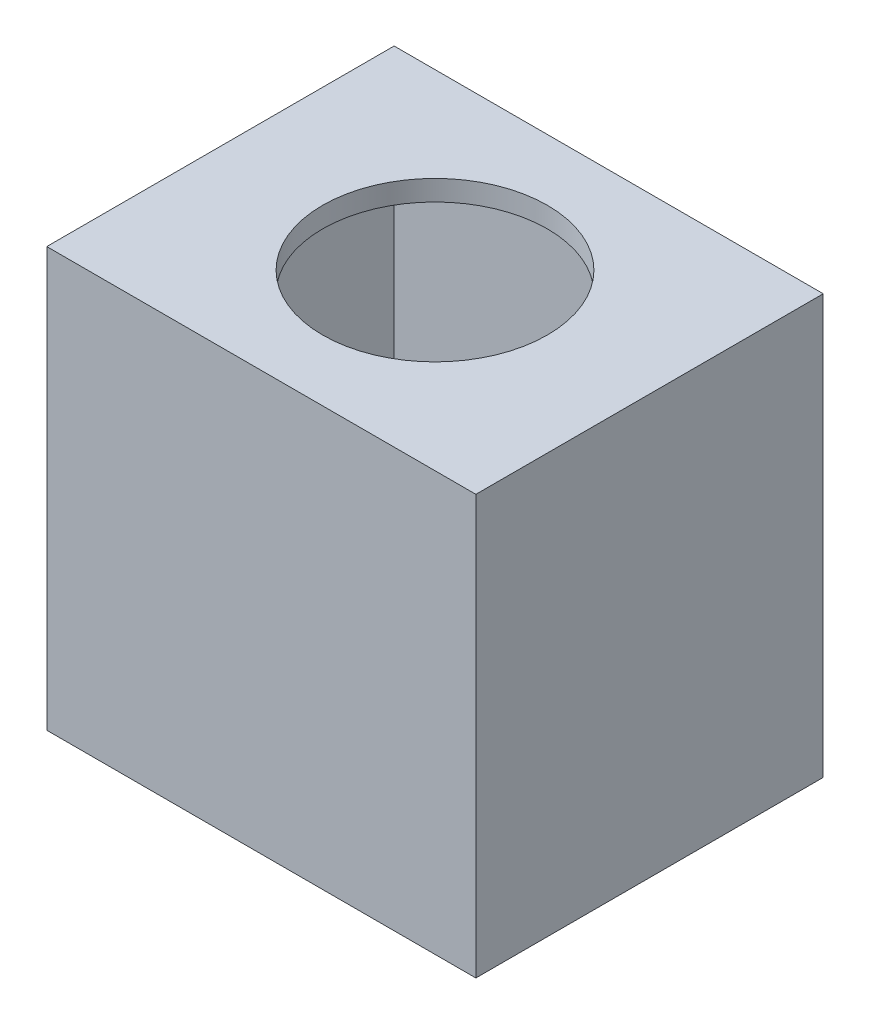
ISO-10303-21;
HEADER;
FILE_DESCRIPTION(('STEP AP214'),'2;1');
FILE_NAME('part.step','',(''),(''),'','','');
FILE_SCHEMA(('AUTOMOTIVE_DESIGN { 1 0 10303 214 1 1 1 1 }'));
ENDSEC;
DATA;
#1=APPLICATION_CONTEXT('core data for automotive mechanical design processes');
#2=APPLICATION_PROTOCOL_DEFINITION('international standard','automotive_design',2000,#1);
#3=PRODUCT_CONTEXT('',#1,'mechanical');
#4=PRODUCT('Part','Part','',(#3));
#5=PRODUCT_RELATED_PRODUCT_CATEGORY('part','',(#4));
#6=PRODUCT_DEFINITION_FORMATION('','',#4);
#7=PRODUCT_DEFINITION_CONTEXT('part definition',#1,'design');
#8=PRODUCT_DEFINITION('design','',#6,#7);
#9=PRODUCT_DEFINITION_SHAPE('','',#8);
#10=(LENGTH_UNIT() NAMED_UNIT(*) SI_UNIT(.MILLI.,.METRE.));
#11=(NAMED_UNIT(*) PLANE_ANGLE_UNIT() SI_UNIT($,.RADIAN.));
#12=(NAMED_UNIT(*) SI_UNIT($,.STERADIAN.) SOLID_ANGLE_UNIT());
#13=UNCERTAINTY_MEASURE_WITH_UNIT(LENGTH_MEASURE(1.E-05),#10,'distance_accuracy_value','');
#14=(GEOMETRIC_REPRESENTATION_CONTEXT(3) GLOBAL_UNCERTAINTY_ASSIGNED_CONTEXT((#13)) GLOBAL_UNIT_ASSIGNED_CONTEXT((#10,
#11,#12)) REPRESENTATION_CONTEXT('',''));
#15=CARTESIAN_POINT('',(0.,0.,0.));
#16=DIRECTION('',(0.,0.,1.));
#17=DIRECTION('',(1.,0.,0.));
#18=AXIS2_PLACEMENT_3D('',#15,#16,#17);
#19=CARTESIAN_POINT('',(-2.,39.,0.));
#20=DIRECTION('',(1.,0.,0.));
#21=DIRECTION('',(0.,0.,-1.));
#22=AXIS2_PLACEMENT_3D('',#19,#20,#21);
#23=PLANE('',#22);
#24=DIRECTION('',(0.,0.,1.));
#25=VECTOR('',#24,1.);
#26=CARTESIAN_POINT('',(-2.,0.,0.));
#27=LINE('',#26,#25);
#28=CARTESIAN_POINT('',(-2.,0.,-2.));
#29=VERTEX_POINT('',#28);
#30=CARTESIAN_POINT('',(-2.,0.,32.));
#31=VERTEX_POINT('',#30);
#32=EDGE_CURVE('E128',#29,#31,#27,.T.);
#33=ORIENTED_EDGE('',*,*,#32,.T.);
#34=DIRECTION('',(0.,-1.,0.));
#35=VECTOR('',#34,1.);
#36=CARTESIAN_POINT('',(-2.,39.,32.));
#37=LINE('',#36,#35);
#38=CARTESIAN_POINT('',(-2.,41.,32.));
#39=VERTEX_POINT('',#38);
#40=EDGE_CURVE('E11',#39,#31,#37,.T.);
#41=ORIENTED_EDGE('',*,*,#40,.F.);
#42=DIRECTION('',(0.,0.,1.));
#43=VECTOR('',#42,1.);
#44=CARTESIAN_POINT('',(-2.,41.,0.));
#45=LINE('',#44,#43);
#46=CARTESIAN_POINT('',(-2.,41.,-2.));
#47=VERTEX_POINT('',#46);
#48=EDGE_CURVE('E112',#47,#39,#45,.T.);
#49=ORIENTED_EDGE('',*,*,#48,.F.);
#50=DIRECTION('',(0.,-1.,0.));
#51=VECTOR('',#50,1.);
#52=CARTESIAN_POINT('',(-2.,39.,-2.));
#53=LINE('',#52,#51);
#54=EDGE_CURVE('E124',#47,#29,#53,.T.);
#55=ORIENTED_EDGE('',*,*,#54,.T.);
#56=EDGE_LOOP('',(#33,#41,#49,#55));
#57=FACE_BOUND('',#56,.T.);
#58=ADVANCED_FACE('F35',(#57),#23,.F.);
#59=CARTESIAN_POINT('',(0.,39.,32.));
#60=DIRECTION('',(0.,0.,-1.));
#61=DIRECTION('',(-1.,0.,0.));
#62=AXIS2_PLACEMENT_3D('',#59,#60,#61);
#63=PLANE('',#62);
#64=DIRECTION('',(1.,0.,0.));
#65=VECTOR('',#64,1.);
#66=CARTESIAN_POINT('',(0.,0.,32.));
#67=LINE('',#66,#65);
#68=CARTESIAN_POINT('',(40.,0.,32.));
#69=VERTEX_POINT('',#68);
#70=EDGE_CURVE('E39',#31,#69,#67,.T.);
#71=ORIENTED_EDGE('',*,*,#70,.T.);
#72=DIRECTION('',(0.,-1.,0.));
#73=VECTOR('',#72,1.);
#74=CARTESIAN_POINT('',(40.,39.,32.));
#75=LINE('',#74,#73);
#76=CARTESIAN_POINT('',(40.,41.,32.));
#77=VERTEX_POINT('',#76);
#78=EDGE_CURVE('E44',#77,#69,#75,.T.);
#79=ORIENTED_EDGE('',*,*,#78,.F.);
#80=DIRECTION('',(1.,0.,0.));
#81=VECTOR('',#80,1.);
#82=CARTESIAN_POINT('',(0.,41.,32.));
#83=LINE('',#82,#81);
#84=EDGE_CURVE('E106',#39,#77,#83,.T.);
#85=ORIENTED_EDGE('',*,*,#84,.F.);
#86=ORIENTED_EDGE('',*,*,#40,.T.);
#87=EDGE_LOOP('',(#71,#79,#85,#86));
#88=FACE_BOUND('',#87,.T.);
#89=ADVANCED_FACE('F117',(#88),#63,.F.);
#90=CARTESIAN_POINT('',(40.,39.,0.));
#91=DIRECTION('',(-1.,0.,0.));
#92=DIRECTION('',(0.,0.,1.));
#93=AXIS2_PLACEMENT_3D('',#90,#91,#92);
#94=PLANE('',#93);
#95=DIRECTION('',(0.,0.,-1.));
#96=VECTOR('',#95,1.);
#97=CARTESIAN_POINT('',(40.,0.,0.));
#98=LINE('',#97,#96);
#99=CARTESIAN_POINT('',(40.,0.,-2.));
#100=VERTEX_POINT('',#99);
#101=EDGE_CURVE('E133',#69,#100,#98,.T.);
#102=ORIENTED_EDGE('',*,*,#101,.T.);
#103=DIRECTION('',(0.,-1.,0.));
#104=VECTOR('',#103,1.);
#105=CARTESIAN_POINT('',(40.,39.,-2.));
#106=LINE('',#105,#104);
#107=CARTESIAN_POINT('',(40.,41.,-2.));
#108=VERTEX_POINT('',#107);
#109=EDGE_CURVE('E119',#108,#100,#106,.T.);
#110=ORIENTED_EDGE('',*,*,#109,.F.);
#111=DIRECTION('',(0.,0.,-1.));
#112=VECTOR('',#111,1.);
#113=CARTESIAN_POINT('',(40.,41.,0.));
#114=LINE('',#113,#112);
#115=EDGE_CURVE('E109',#77,#108,#114,.T.);
#116=ORIENTED_EDGE('',*,*,#115,.F.);
#117=ORIENTED_EDGE('',*,*,#78,.T.);
#118=EDGE_LOOP('',(#102,#110,#116,#117));
#119=FACE_BOUND('',#118,.T.);
#120=ADVANCED_FACE('F121',(#119),#94,.F.);
#121=CARTESIAN_POINT('',(0.,39.,-2.));
#122=DIRECTION('',(0.,0.,1.));
#123=DIRECTION('',(1.,0.,0.));
#124=AXIS2_PLACEMENT_3D('',#121,#122,#123);
#125=PLANE('',#124);
#126=DIRECTION('',(-1.,0.,0.));
#127=VECTOR('',#126,1.);
#128=CARTESIAN_POINT('',(0.,0.,-2.));
#129=LINE('',#128,#127);
#130=EDGE_CURVE('E132',#100,#29,#129,.T.);
#131=ORIENTED_EDGE('',*,*,#130,.T.);
#132=ORIENTED_EDGE('',*,*,#54,.F.);
#133=DIRECTION('',(-1.,0.,0.));
#134=VECTOR('',#133,1.);
#135=CARTESIAN_POINT('',(0.,41.,-2.));
#136=LINE('',#135,#134);
#137=EDGE_CURVE('E61',#108,#47,#136,.T.);
#138=ORIENTED_EDGE('',*,*,#137,.F.);
#139=ORIENTED_EDGE('',*,*,#109,.T.);
#140=EDGE_LOOP('',(#131,#132,#138,#139));
#141=FACE_BOUND('',#140,.T.);
#142=ADVANCED_FACE('F136',(#141),#125,.F.);
#143=CARTESIAN_POINT('',(0.,41.,0.));
#144=DIRECTION('',(0.,1.,0.));
#145=DIRECTION('',(0.,0.,1.));
#146=AXIS2_PLACEMENT_3D('',#143,#144,#145);
#147=PLANE('',#146);
#148=CARTESIAN_POINT('',(19.,41.,15.));
#149=DIRECTION('',(0.,1.,0.));
#150=DIRECTION('',(0.,0.,1.));
#151=AXIS2_PLACEMENT_3D('',#148,#149,#150);
#152=CIRCLE('',#151,11.);
#153=CARTESIAN_POINT('',(19.,41.,26.));
#154=VERTEX_POINT('',#153);
#155=EDGE_CURVE('E173',#154,#154,#152,.T.);
#156=ORIENTED_EDGE('',*,*,#155,.F.);
#157=EDGE_LOOP('',(#156));
#158=FACE_BOUND('',#157,.T.);
#159=ORIENTED_EDGE('',*,*,#48,.T.);
#160=ORIENTED_EDGE('',*,*,#84,.T.);
#161=ORIENTED_EDGE('',*,*,#115,.T.);
#162=ORIENTED_EDGE('',*,*,#137,.T.);
#163=EDGE_LOOP('',(#159,#160,#161,#162));
#164=FACE_BOUND('',#163,.T.);
#165=ADVANCED_FACE('F37',(#158,#164),#147,.T.);
#166=CARTESIAN_POINT('',(0.,0.,0.));
#167=DIRECTION('',(0.,1.,0.));
#168=DIRECTION('',(0.,0.,1.));
#169=AXIS2_PLACEMENT_3D('',#166,#167,#168);
#170=PLANE('',#169);
#171=DIRECTION('',(-1.,0.,0.));
#172=VECTOR('',#171,1.);
#173=CARTESIAN_POINT('',(0.,0.,0.));
#174=LINE('',#173,#172);
#175=CARTESIAN_POINT('',(38.,0.,0.));
#176=VERTEX_POINT('',#175);
#177=CARTESIAN_POINT('',(0.,0.,0.));
#178=VERTEX_POINT('',#177);
#179=EDGE_CURVE('E151',#176,#178,#174,.T.);
#180=ORIENTED_EDGE('',*,*,#179,.T.);
#181=DIRECTION('',(0.,0.,1.));
#182=VECTOR('',#181,1.);
#183=CARTESIAN_POINT('',(0.,0.,0.));
#184=LINE('',#183,#182);
#185=CARTESIAN_POINT('',(0.,0.,30.));
#186=VERTEX_POINT('',#185);
#187=EDGE_CURVE('E159',#178,#186,#184,.T.);
#188=ORIENTED_EDGE('',*,*,#187,.T.);
#189=DIRECTION('',(1.,0.,0.));
#190=VECTOR('',#189,1.);
#191=CARTESIAN_POINT('',(0.,0.,30.));
#192=LINE('',#191,#190);
#193=CARTESIAN_POINT('',(38.,0.,30.));
#194=VERTEX_POINT('',#193);
#195=EDGE_CURVE('E156',#186,#194,#192,.T.);
#196=ORIENTED_EDGE('',*,*,#195,.T.);
#197=DIRECTION('',(0.,0.,-1.));
#198=VECTOR('',#197,1.);
#199=CARTESIAN_POINT('',(38.,0.,0.));
#200=LINE('',#199,#198);
#201=EDGE_CURVE('E52',#194,#176,#200,.T.);
#202=ORIENTED_EDGE('',*,*,#201,.T.);
#203=EDGE_LOOP('',(#180,#188,#196,#202));
#204=FACE_BOUND('',#203,.T.);
#205=ORIENTED_EDGE('',*,*,#32,.F.);
#206=ORIENTED_EDGE('',*,*,#130,.F.);
#207=ORIENTED_EDGE('',*,*,#101,.F.);
#208=ORIENTED_EDGE('',*,*,#70,.F.);
#209=EDGE_LOOP('',(#205,#206,#207,#208));
#210=FACE_BOUND('',#209,.T.);
#211=ADVANCED_FACE('F138',(#204,#210),#170,.F.);
#212=CARTESIAN_POINT('',(0.,39.,0.));
#213=DIRECTION('',(1.,0.,0.));
#214=DIRECTION('',(0.,0.,-1.));
#215=AXIS2_PLACEMENT_3D('',#212,#213,#214);
#216=PLANE('',#215);
#217=ORIENTED_EDGE('',*,*,#187,.F.);
#218=DIRECTION('',(0.,-1.,0.));
#219=VECTOR('',#218,1.);
#220=CARTESIAN_POINT('',(0.,39.,0.));
#221=LINE('',#220,#219);
#222=CARTESIAN_POINT('',(0.,39.,0.));
#223=VERTEX_POINT('',#222);
#224=EDGE_CURVE('E149',#223,#178,#221,.T.);
#225=ORIENTED_EDGE('',*,*,#224,.F.);
#226=DIRECTION('',(0.,0.,1.));
#227=VECTOR('',#226,1.);
#228=CARTESIAN_POINT('',(0.,39.,0.));
#229=LINE('',#228,#227);
#230=CARTESIAN_POINT('',(0.,39.,30.));
#231=VERTEX_POINT('',#230);
#232=EDGE_CURVE('E154',#223,#231,#229,.T.);
#233=ORIENTED_EDGE('',*,*,#232,.T.);
#234=DIRECTION('',(0.,-1.,0.));
#235=VECTOR('',#234,1.);
#236=CARTESIAN_POINT('',(0.,39.,30.));
#237=LINE('',#236,#235);
#238=EDGE_CURVE('E131',#231,#186,#237,.T.);
#239=ORIENTED_EDGE('',*,*,#238,.T.);
#240=EDGE_LOOP('',(#217,#225,#233,#239));
#241=FACE_BOUND('',#240,.T.);
#242=ADVANCED_FACE('F185',(#241),#216,.T.);
#243=CARTESIAN_POINT('',(0.,39.,30.));
#244=DIRECTION('',(0.,0.,-1.));
#245=DIRECTION('',(-1.,0.,0.));
#246=AXIS2_PLACEMENT_3D('',#243,#244,#245);
#247=PLANE('',#246);
#248=ORIENTED_EDGE('',*,*,#195,.F.);
#249=ORIENTED_EDGE('',*,*,#238,.F.);
#250=DIRECTION('',(1.,0.,0.));
#251=VECTOR('',#250,1.);
#252=CARTESIAN_POINT('',(0.,39.,30.));
#253=LINE('',#252,#251);
#254=CARTESIAN_POINT('',(38.,39.,30.));
#255=VERTEX_POINT('',#254);
#256=EDGE_CURVE('E166',#231,#255,#253,.T.);
#257=ORIENTED_EDGE('',*,*,#256,.T.);
#258=DIRECTION('',(0.,-1.,0.));
#259=VECTOR('',#258,1.);
#260=CARTESIAN_POINT('',(38.,39.,30.));
#261=LINE('',#260,#259);
#262=EDGE_CURVE('E145',#255,#194,#261,.T.);
#263=ORIENTED_EDGE('',*,*,#262,.T.);
#264=EDGE_LOOP('',(#248,#249,#257,#263));
#265=FACE_BOUND('',#264,.T.);
#266=ADVANCED_FACE('F221',(#265),#247,.T.);
#267=CARTESIAN_POINT('',(38.,39.,0.));
#268=DIRECTION('',(-1.,0.,0.));
#269=DIRECTION('',(0.,0.,1.));
#270=AXIS2_PLACEMENT_3D('',#267,#268,#269);
#271=PLANE('',#270);
#272=ORIENTED_EDGE('',*,*,#201,.F.);
#273=ORIENTED_EDGE('',*,*,#262,.F.);
#274=DIRECTION('',(0.,0.,-1.));
#275=VECTOR('',#274,1.);
#276=CARTESIAN_POINT('',(38.,39.,0.));
#277=LINE('',#276,#275);
#278=CARTESIAN_POINT('',(38.,39.,0.));
#279=VERTEX_POINT('',#278);
#280=EDGE_CURVE('E164',#255,#279,#277,.T.);
#281=ORIENTED_EDGE('',*,*,#280,.T.);
#282=DIRECTION('',(0.,-1.,0.));
#283=VECTOR('',#282,1.);
#284=CARTESIAN_POINT('',(38.,39.,0.));
#285=LINE('',#284,#283);
#286=EDGE_CURVE('E147',#279,#176,#285,.T.);
#287=ORIENTED_EDGE('',*,*,#286,.T.);
#288=EDGE_LOOP('',(#272,#273,#281,#287));
#289=FACE_BOUND('',#288,.T.);
#290=ADVANCED_FACE('F230',(#289),#271,.T.);
#291=CARTESIAN_POINT('',(0.,39.,0.));
#292=DIRECTION('',(0.,0.,1.));
#293=DIRECTION('',(1.,0.,0.));
#294=AXIS2_PLACEMENT_3D('',#291,#292,#293);
#295=PLANE('',#294);
#296=ORIENTED_EDGE('',*,*,#179,.F.);
#297=ORIENTED_EDGE('',*,*,#286,.F.);
#298=DIRECTION('',(-1.,0.,0.));
#299=VECTOR('',#298,1.);
#300=CARTESIAN_POINT('',(0.,39.,0.));
#301=LINE('',#300,#299);
#302=EDGE_CURVE('E89',#279,#223,#301,.T.);
#303=ORIENTED_EDGE('',*,*,#302,.T.);
#304=ORIENTED_EDGE('',*,*,#224,.T.);
#305=EDGE_LOOP('',(#296,#297,#303,#304));
#306=FACE_BOUND('',#305,.T.);
#307=ADVANCED_FACE('F240',(#306),#295,.T.);
#308=CARTESIAN_POINT('',(0.,39.,0.));
#309=DIRECTION('',(0.,1.,0.));
#310=DIRECTION('',(0.,0.,1.));
#311=AXIS2_PLACEMENT_3D('',#308,#309,#310);
#312=PLANE('',#311);
#313=CARTESIAN_POINT('',(19.,39.,15.));
#314=DIRECTION('',(0.,1.,0.));
#315=DIRECTION('',(0.,0.,1.));
#316=AXIS2_PLACEMENT_3D('',#313,#314,#315);
#317=CIRCLE('',#316,11.);
#318=CARTESIAN_POINT('',(19.,39.,26.));
#319=VERTEX_POINT('',#318);
#320=EDGE_CURVE('E162',#319,#319,#317,.F.);
#321=ORIENTED_EDGE('',*,*,#320,.F.);
#322=EDGE_LOOP('',(#321));
#323=FACE_BOUND('',#322,.T.);
#324=ORIENTED_EDGE('',*,*,#232,.F.);
#325=ORIENTED_EDGE('',*,*,#302,.F.);
#326=ORIENTED_EDGE('',*,*,#280,.F.);
#327=ORIENTED_EDGE('',*,*,#256,.F.);
#328=EDGE_LOOP('',(#324,#325,#326,#327));
#329=FACE_BOUND('',#328,.T.);
#330=ADVANCED_FACE('F248',(#323,#329),#312,.F.);
#331=CARTESIAN_POINT('',(19.,-0.001000000000001,15.));
#332=DIRECTION('',(0.,1.,0.));
#333=DIRECTION('',(0.,0.,1.));
#334=AXIS2_PLACEMENT_3D('',#331,#332,#333);
#335=CYLINDRICAL_SURFACE('',#334,11.);
#336=CARTESIAN_POINT('',(19.,41.,26.));
#337=CARTESIAN_POINT('',(19.,40.9791666666667,26.));
#338=CARTESIAN_POINT('',(19.,40.9583333333333,26.));
#339=CARTESIAN_POINT('',(19.,40.9166666666667,26.));
#340=CARTESIAN_POINT('',(19.,40.8958333333333,26.));
#341=CARTESIAN_POINT('',(19.,40.8541666666667,26.));
#342=CARTESIAN_POINT('',(19.,40.8333333333333,26.));
#343=CARTESIAN_POINT('',(19.,40.7916666666667,26.));
#344=CARTESIAN_POINT('',(19.,40.7708333333333,26.));
#345=CARTESIAN_POINT('',(19.,40.7291666666667,26.));
#346=CARTESIAN_POINT('',(19.,40.7083333333333,26.));
#347=CARTESIAN_POINT('',(19.,40.6666666666667,26.));
#348=CARTESIAN_POINT('',(19.,40.6458333333333,26.));
#349=CARTESIAN_POINT('',(19.,40.6041666666667,26.));
#350=CARTESIAN_POINT('',(19.,40.5833333333333,26.));
#351=CARTESIAN_POINT('',(19.,40.5416666666667,26.));
#352=CARTESIAN_POINT('',(19.,40.5208333333333,26.));
#353=CARTESIAN_POINT('',(19.,40.4791666666667,26.));
#354=CARTESIAN_POINT('',(19.,40.4583333333333,26.));
#355=CARTESIAN_POINT('',(19.,40.4166666666667,26.));
#356=CARTESIAN_POINT('',(19.,40.3958333333333,26.));
#357=CARTESIAN_POINT('',(19.,40.3541666666667,26.));
#358=CARTESIAN_POINT('',(19.,40.3333333333333,26.));
#359=CARTESIAN_POINT('',(19.,40.2916666666667,26.));
#360=CARTESIAN_POINT('',(19.,40.2708333333333,26.));
#361=CARTESIAN_POINT('',(19.,40.2291666666667,26.));
#362=CARTESIAN_POINT('',(19.,40.2083333333333,26.));
#363=CARTESIAN_POINT('',(19.,40.1666666666667,26.));
#364=CARTESIAN_POINT('',(19.,40.1458333333333,26.));
#365=CARTESIAN_POINT('',(19.,40.1041666666667,26.));
#366=CARTESIAN_POINT('',(19.,40.0833333333333,26.));
#367=CARTESIAN_POINT('',(19.,40.0416666666667,26.));
#368=CARTESIAN_POINT('',(19.,40.0208333333333,26.));
#369=CARTESIAN_POINT('',(19.,39.9791666666667,26.));
#370=CARTESIAN_POINT('',(19.,39.9583333333333,26.));
#371=CARTESIAN_POINT('',(19.,39.9166666666667,26.));
#372=CARTESIAN_POINT('',(19.,39.8958333333333,26.));
#373=CARTESIAN_POINT('',(19.,39.8541666666667,26.));
#374=CARTESIAN_POINT('',(19.,39.8333333333333,26.));
#375=CARTESIAN_POINT('',(19.,39.7916666666667,26.));
#376=CARTESIAN_POINT('',(19.,39.7708333333333,26.));
#377=CARTESIAN_POINT('',(19.,39.7291666666667,26.));
#378=CARTESIAN_POINT('',(19.,39.7083333333333,26.));
#379=CARTESIAN_POINT('',(19.,39.6666666666667,26.));
#380=CARTESIAN_POINT('',(19.,39.6458333333333,26.));
#381=CARTESIAN_POINT('',(19.,39.6041666666667,26.));
#382=CARTESIAN_POINT('',(19.,39.5833333333333,26.));
#383=CARTESIAN_POINT('',(19.,39.5416666666667,26.));
#384=CARTESIAN_POINT('',(19.,39.5208333333333,26.));
#385=CARTESIAN_POINT('',(19.,39.4791666666667,26.));
#386=CARTESIAN_POINT('',(19.,39.4583333333333,26.));
#387=CARTESIAN_POINT('',(19.,39.4166666666667,26.));
#388=CARTESIAN_POINT('',(19.,39.3958333333333,26.));
#389=CARTESIAN_POINT('',(19.,39.3541666666667,26.));
#390=CARTESIAN_POINT('',(19.,39.3333333333333,26.));
#391=CARTESIAN_POINT('',(19.,39.2916666666667,26.));
#392=CARTESIAN_POINT('',(19.,39.2708333333333,26.));
#393=CARTESIAN_POINT('',(19.,39.2291666666667,26.));
#394=CARTESIAN_POINT('',(19.,39.2083333333333,26.));
#395=CARTESIAN_POINT('',(19.,39.1666666666667,26.));
#396=CARTESIAN_POINT('',(19.,39.1458333333333,26.));
#397=CARTESIAN_POINT('',(19.,39.1041666666667,26.));
#398=CARTESIAN_POINT('',(19.,39.0833333333333,26.));
#399=CARTESIAN_POINT('',(19.,39.0416666666667,26.));
#400=CARTESIAN_POINT('',(19.,39.0208333333333,26.));
#401=CARTESIAN_POINT('',(19.,39.,26.));
#402=B_SPLINE_CURVE_WITH_KNOTS('',3,(#336,#337,#338,#339,#340,#341,#342,#343,#344,#345,#346,
#347,#348,#349,#350,#351,#352,#353,#354,#355,#356,#357,#358,#359,#360,#361,#362,#363,#364,#365,
#366,#367,#368,#369,#370,#371,#372,#373,#374,#375,#376,#377,#378,#379,#380,#381,#382,#383,#384,
#385,#386,#387,#388,#389,#390,#391,#392,#393,#394,#395,#396,#397,#398,#399,#400,#401),
.UNSPECIFIED.,.F.,.F.,(4,2,2,2,2,2,2,2,2,2,2,2,2,2,2,2,2,2,2,2,2,2,2,2,2,2,2,2,2,2,2,2,4),(0.,
0.0625000000000001,0.125,0.1875,0.25,0.3125,0.375,0.4375,0.5,0.5625,0.625000000000001,
0.687500000000001,0.750000000000001,0.812500000000001,0.875000000000001,0.937500000000001,1.,
1.0625,1.125,1.1875,1.25,1.3125,1.375,1.4375,1.5,1.5625,1.625,1.6875,1.75,1.8125,1.875,1.9375,
2.),.UNSPECIFIED.);
#403=EDGE_CURVE('BSEAM177',#154,#319,#402,.T.);
#404=ORIENTED_EDGE('',*,*,#155,.T.);
#405=ORIENTED_EDGE('',*,*,#320,.T.);
#406=ORIENTED_EDGE('',*,*,#403,.T.);
#407=ORIENTED_EDGE('',*,*,#403,.F.);
#408=EDGE_LOOP('',(#404,#406,#405,#407));
#409=FACE_BOUND('',#408,.T.);
#410=ADVANCED_FACE('F177',(#409),#335,.F.);
#411=CLOSED_SHELL('',(#58,#89,#120,#142,#165,#211,#242,#266,#290,#307,#330,#410));
#412=MANIFOLD_SOLID_BREP('B2',#411);
#413=ADVANCED_BREP_SHAPE_REPRESENTATION('',(#18,#412),#14);
#414=SHAPE_DEFINITION_REPRESENTATION(#9,#413);
ENDSEC;
END-ISO-10303-21;
